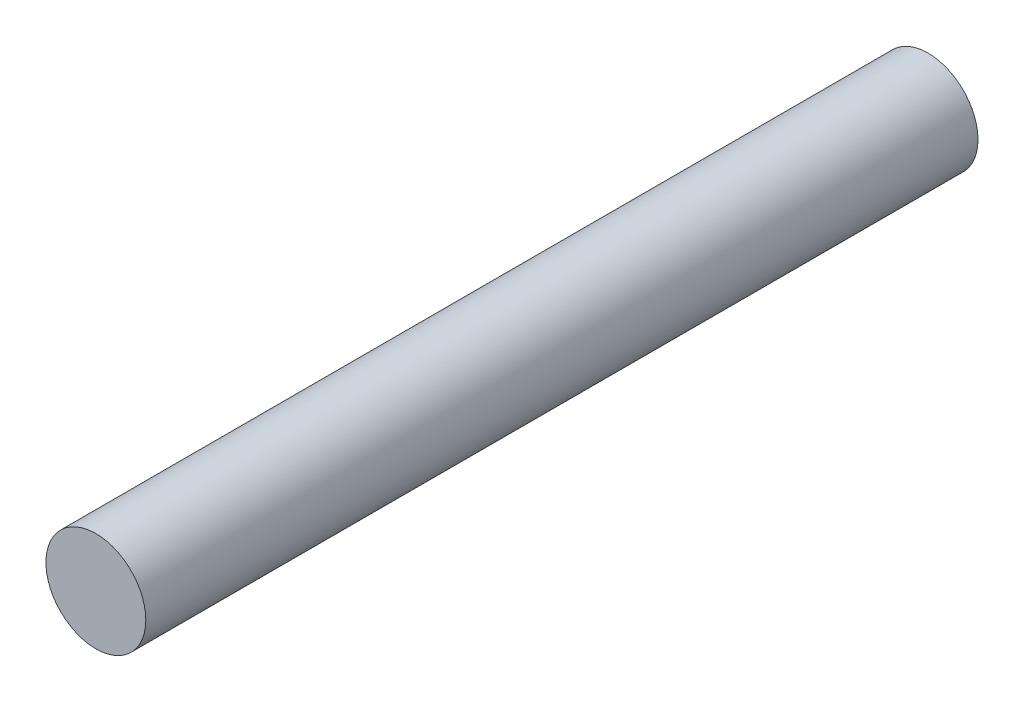
ISO-10303-21;
HEADER;
FILE_DESCRIPTION(('STEP AP214'),'2;1');
FILE_NAME('part.step','',(''),(''),'','','');
FILE_SCHEMA(('AUTOMOTIVE_DESIGN { 1 0 10303 214 1 1 1 1 }'));
ENDSEC;
DATA;
#1=APPLICATION_CONTEXT('core data for automotive mechanical design processes');
#2=APPLICATION_PROTOCOL_DEFINITION('international standard','automotive_design',2000,#1);
#3=PRODUCT_CONTEXT('',#1,'mechanical');
#4=PRODUCT('Part','Part','',(#3));
#5=PRODUCT_RELATED_PRODUCT_CATEGORY('part','',(#4));
#6=PRODUCT_DEFINITION_FORMATION('','',#4);
#7=PRODUCT_DEFINITION_CONTEXT('part definition',#1,'design');
#8=PRODUCT_DEFINITION('design','',#6,#7);
#9=PRODUCT_DEFINITION_SHAPE('','',#8);
#10=(LENGTH_UNIT() NAMED_UNIT(*) SI_UNIT(.MILLI.,.METRE.));
#11=(NAMED_UNIT(*) PLANE_ANGLE_UNIT() SI_UNIT($,.RADIAN.));
#12=(NAMED_UNIT(*) SI_UNIT($,.STERADIAN.) SOLID_ANGLE_UNIT());
#13=UNCERTAINTY_MEASURE_WITH_UNIT(LENGTH_MEASURE(1.E-05),#10,'distance_accuracy_value','');
#14=(GEOMETRIC_REPRESENTATION_CONTEXT(3) GLOBAL_UNCERTAINTY_ASSIGNED_CONTEXT((#13)) GLOBAL_UNIT_ASSIGNED_CONTEXT((#10,
#11,#12)) REPRESENTATION_CONTEXT('',''));
#15=CARTESIAN_POINT('',(0.,0.,0.));
#16=DIRECTION('',(0.,0.,1.));
#17=DIRECTION('',(1.,0.,0.));
#18=AXIS2_PLACEMENT_3D('',#15,#16,#17);
#19=CARTESIAN_POINT('',(-26.7170640460185,0.,50.));
#20=DIRECTION('',(0.,0.,-1.));
#21=DIRECTION('',(-1.,0.,0.));
#22=AXIS2_PLACEMENT_3D('',#19,#20,#21);
#23=CYLINDRICAL_SURFACE('',#22,3.);
#24=CARTESIAN_POINT('',(-26.7170640460185,0.,50.));
#25=DIRECTION('',(0.,0.,1.));
#26=DIRECTION('',(1.,0.,0.));
#27=AXIS2_PLACEMENT_3D('',#24,#25,#26);
#28=CIRCLE('',#27,3.);
#29=CARTESIAN_POINT('',(-23.7170640460185,0.,50.));
#30=VERTEX_POINT('',#29);
#31=EDGE_CURVE('E10',#30,#30,#28,.T.);
#32=ORIENTED_EDGE('',*,*,#31,.F.);
#33=EDGE_LOOP('',(#32));
#34=FACE_BOUND('',#33,.T.);
#35=CARTESIAN_POINT('',(-26.7170640460185,0.,0.));
#36=DIRECTION('',(0.,0.,1.));
#37=DIRECTION('',(1.,0.,0.));
#38=AXIS2_PLACEMENT_3D('',#35,#36,#37);
#39=CIRCLE('',#38,3.);
#40=CARTESIAN_POINT('',(-23.7170640460185,0.,0.));
#41=VERTEX_POINT('',#40);
#42=EDGE_CURVE('E33',#41,#41,#39,.T.);
#43=ORIENTED_EDGE('',*,*,#42,.T.);
#44=EDGE_LOOP('',(#43));
#45=FACE_BOUND('',#44,.T.);
#46=ADVANCED_FACE('F30',(#34,#45),#23,.T.);
#47=CARTESIAN_POINT('',(-26.7170640460185,0.,50.));
#48=DIRECTION('',(0.,0.,1.));
#49=DIRECTION('',(1.,0.,0.));
#50=AXIS2_PLACEMENT_3D('',#47,#48,#49);
#51=PLANE('',#50);
#52=ORIENTED_EDGE('',*,*,#31,.T.);
#53=EDGE_LOOP('',(#52));
#54=FACE_BOUND('',#53,.T.);
#55=ADVANCED_FACE('F45',(#54),#51,.T.);
#56=CARTESIAN_POINT('',(-26.7170640460185,0.,0.));
#57=DIRECTION('',(0.,0.,1.));
#58=DIRECTION('',(1.,0.,0.));
#59=AXIS2_PLACEMENT_3D('',#56,#57,#58);
#60=PLANE('',#59);
#61=ORIENTED_EDGE('',*,*,#42,.F.);
#62=EDGE_LOOP('',(#61));
#63=FACE_BOUND('',#62,.T.);
#64=ADVANCED_FACE('F43',(#63),#60,.F.);
#65=CLOSED_SHELL('',(#46,#55,#64));
#66=MANIFOLD_SOLID_BREP('B2',#65);
#67=ADVANCED_BREP_SHAPE_REPRESENTATION('',(#18,#66),#14);
#68=SHAPE_DEFINITION_REPRESENTATION(#9,#67);
ENDSEC;
END-ISO-10303-21;
